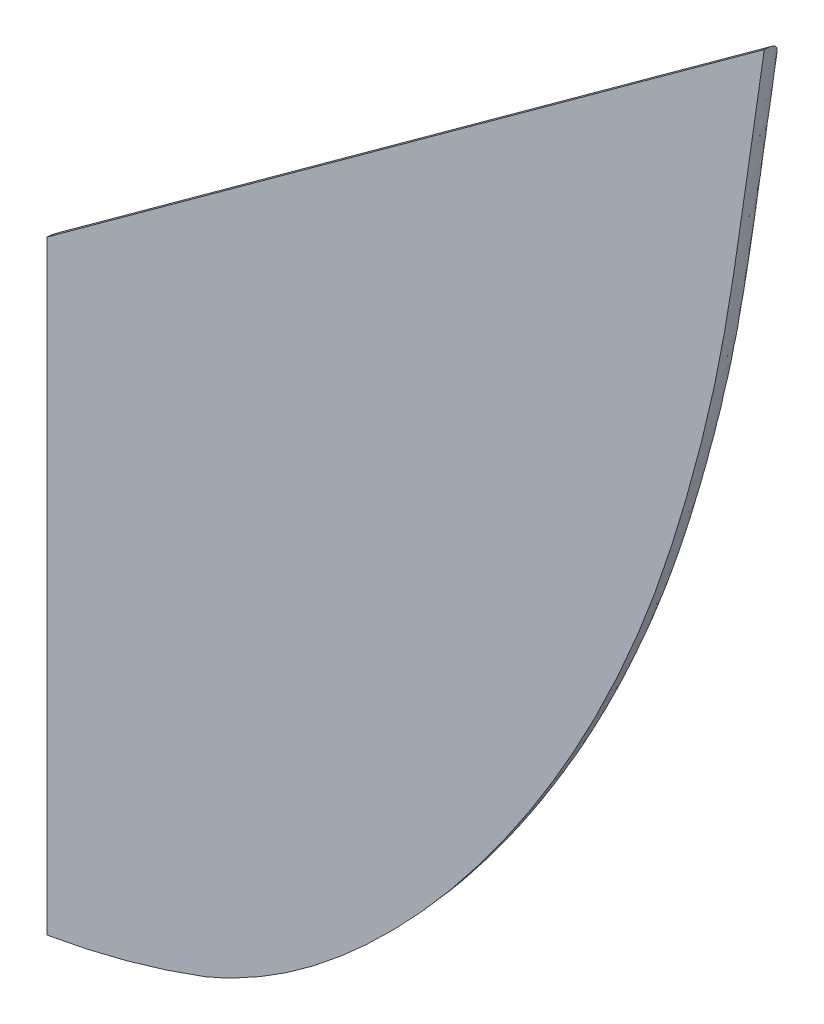
ISO-10303-21;
HEADER;
FILE_DESCRIPTION(('STEP AP214'),'2;1');
FILE_NAME('part.step','',(''),(''),'','','');
FILE_SCHEMA(('AUTOMOTIVE_DESIGN { 1 0 10303 214 1 1 1 1 }'));
ENDSEC;
DATA;
#1=APPLICATION_CONTEXT('core data for automotive mechanical design processes');
#2=APPLICATION_PROTOCOL_DEFINITION('international standard','automotive_design',2000,#1);
#3=PRODUCT_CONTEXT('',#1,'mechanical');
#4=PRODUCT('Part','Part','',(#3));
#5=PRODUCT_RELATED_PRODUCT_CATEGORY('part','',(#4));
#6=PRODUCT_DEFINITION_FORMATION('','',#4);
#7=PRODUCT_DEFINITION_CONTEXT('part definition',#1,'design');
#8=PRODUCT_DEFINITION('design','',#6,#7);
#9=PRODUCT_DEFINITION_SHAPE('','',#8);
#10=(LENGTH_UNIT() NAMED_UNIT(*) SI_UNIT(.MILLI.,.METRE.));
#11=(NAMED_UNIT(*) PLANE_ANGLE_UNIT() SI_UNIT($,.RADIAN.));
#12=(NAMED_UNIT(*) SI_UNIT($,.STERADIAN.) SOLID_ANGLE_UNIT());
#13=UNCERTAINTY_MEASURE_WITH_UNIT(LENGTH_MEASURE(1.E-05),#10,'distance_accuracy_value','');
#14=(GEOMETRIC_REPRESENTATION_CONTEXT(3) GLOBAL_UNCERTAINTY_ASSIGNED_CONTEXT((#13)) GLOBAL_UNIT_ASSIGNED_CONTEXT((#10,
#11,#12)) REPRESENTATION_CONTEXT('',''));
#15=CARTESIAN_POINT('',(0.,0.,0.));
#16=DIRECTION('',(0.,0.,1.));
#17=DIRECTION('',(1.,0.,0.));
#18=AXIS2_PLACEMENT_3D('',#15,#16,#17);
#19=CARTESIAN_POINT('',(130.75756911638,31.0759751053134,-1.14467768131097));
#20=DIRECTION('',(-0.809093604231756,-0.587679793219726,1.52475133105402E-05));
#21=DIRECTION('',(-0.587679793417526,0.80909360396028,-2.09594605061999E-05));
#22=AXIS2_PLACEMENT_3D('',#19,#20,#21);
#23=CYLINDRICAL_SURFACE('',#22,1.00000000000017);
#24=DIRECTION('',(-0.809093604231753,-0.587679793220006,1.52368888238317E-05));
#25=VECTOR('',#24,1.);
#26=CARTESIAN_POINT('',(139.352425500452,38.5547431867359,-1.14487156672482));
#27=LINE('',#26,#25);
#28=CARTESIAN_POINT('',(139.352425491807,38.5547431803267,-1.14487182181001));
#29=VERTEX_POINT('',#28);
#30=CARTESIAN_POINT('',(120.987353142415,25.2153942296326,-1.14452567025889));
#31=VERTEX_POINT('',#30);
#32=EDGE_CURVE('E106',#29,#31,#27,.T.);
#33=ORIENTED_EDGE('',*,*,#32,.F.);
#34=CARTESIAN_POINT('',(138.021027173442,36.3517139340818,-2.14481456214117));
#35=CARTESIAN_POINT('',(138.044914616573,36.3913245987506,-2.14481444479535));
#36=CARTESIAN_POINT('',(138.068808354182,36.4309317209375,-2.14433157605727));
#37=CARTESIAN_POINT('',(138.119829352194,36.5154849360455,-2.14225926465754));
#38=CARTESIAN_POINT('',(138.146956358072,36.5604277589641,-2.14052883661967));
#39=CARTESIAN_POINT('',(138.204440269134,36.6556504230444,-2.13551282753212));
#40=CARTESIAN_POINT('',(138.234794214632,36.7059236647612,-2.13206557453358));
#41=CARTESIAN_POINT('',(138.291219821142,36.7993077768855,-2.12412813901693));
#42=CARTESIAN_POINT('',(138.317295223292,36.8424346441796,-2.11985193303039));
#43=CARTESIAN_POINT('',(138.369477974665,36.9286635380226,-2.11002511885288));
#44=CARTESIAN_POINT('',(138.395585255475,36.9717652693112,-2.10447154651515));
#45=CARTESIAN_POINT('',(138.447635664188,37.058017994149,-2.09209670029287));
#46=CARTESIAN_POINT('',(138.47357830021,37.1011688852481,-2.08527264482612));
#47=CARTESIAN_POINT('',(138.527185211177,37.1903657160663,-2.06974221540705));
#48=CARTESIAN_POINT('',(138.554840951477,37.236399690184,-2.06093659961522));
#49=CARTESIAN_POINT('',(138.608434413312,37.325276106524,-2.04217262664027));
#50=CARTESIAN_POINT('',(138.634372812667,37.3681401589199,-2.03231897053418));
#51=CARTESIAN_POINT('',(138.684382456294,37.4507398953528,-2.01169967290987));
#52=CARTESIAN_POINT('',(138.708463841042,37.4904951667349,-2.0010372927875));
#53=CARTESIAN_POINT('',(138.754724963855,37.5668788488836,-1.97900951905835));
#54=CARTESIAN_POINT('',(138.776918307465,37.603528832044,-1.96774781345462));
#55=CARTESIAN_POINT('',(138.819384191235,37.6737071824561,-1.94473067254878));
#56=CARTESIAN_POINT('',(138.839673523663,37.7072594164158,-1.93307931629751));
#57=CARTESIAN_POINT('',(138.878342535015,37.7712396194916,-1.90948227622664));
#58=CARTESIAN_POINT('',(138.896740598515,37.8016951853737,-1.89764181153114));
#59=CARTESIAN_POINT('',(138.935783782891,37.866256832906,-1.87103569198479));
#60=CARTESIAN_POINT('',(138.956400541583,37.9003067160335,-1.8560905880942));
#61=CARTESIAN_POINT('',(138.995962289951,37.9656133858179,-1.82540596357176));
#62=CARTESIAN_POINT('',(139.014929674932,37.9969092168504,-1.80977892427148));
#63=CARTESIAN_POINT('',(139.051153661114,38.056706985495,-1.7778729196878));
#64=CARTESIAN_POINT('',(139.068438723906,38.0852539156758,-1.76171107546343));
#65=CARTESIAN_POINT('',(139.10128366916,38.1395467635796,-1.72886991402852));
#66=CARTESIAN_POINT('',(139.116877694487,38.1653455711152,-1.71231334986451));
#67=CARTESIAN_POINT('',(139.139415137792,38.2026582482913,-1.68668523506533));
#68=CARTESIAN_POINT('',(139.146570636481,38.2145088832403,-1.67828762828367));
#69=CARTESIAN_POINT('',(139.160456839389,38.2375097260996,-1.66142660106892));
#70=CARTESIAN_POINT('',(139.167192973265,38.248668800095,-1.65297980049724));
#71=CARTESIAN_POINT('',(139.180243002732,38.2702848845769,-1.63603674107537));
#72=CARTESIAN_POINT('',(139.186562741216,38.2807516830728,-1.6275575048564));
#73=CARTESIAN_POINT('',(139.198784379323,38.3009782535486,-1.61056211040462));
#74=CARTESIAN_POINT('',(139.204692510982,38.31074899785,-1.60206351724264));
#75=CARTESIAN_POINT('',(139.217472752752,38.3318690960119,-1.58299160296147));
#76=CARTESIAN_POINT('',(139.224312289534,38.3431615876842,-1.5723330985381));
#77=CARTESIAN_POINT('',(139.237442209241,38.3648403806385,-1.5508698719308));
#78=CARTESIAN_POINT('',(139.243743587529,38.3752448150221,-1.54009025645635));
#79=CARTESIAN_POINT('',(139.25579364507,38.3951421472502,-1.51840476772144));
#80=CARTESIAN_POINT('',(139.26155443618,38.404654998743,-1.50752400272341));
#81=CARTESIAN_POINT('',(139.272520852329,38.4227677367627,-1.48565818832843));
#82=CARTESIAN_POINT('',(139.277739706103,38.431389304687,-1.47469788833155));
#83=CARTESIAN_POINT('',(139.285230908949,38.4437666912818,-1.4580172824324));
#84=CARTESIAN_POINT('',(139.287633407932,38.44773654306,-1.45251311571739));
#85=CARTESIAN_POINT('',(139.292301048555,38.4554495138311,-1.44149035287415));
#86=CARTESIAN_POINT('',(139.294568042868,38.4591956890425,-1.43597468746902));
#87=CARTESIAN_POINT('',(139.298964793356,38.4664608643181,-1.42493181783663));
#88=CARTESIAN_POINT('',(139.301096459738,38.4699830294549,-1.41940745897766));
#89=CARTESIAN_POINT('',(139.305222811356,38.4768000715052,-1.4083501105954));
#90=CARTESIAN_POINT('',(139.307219456974,38.4800982080833,-1.40281986380408));
#91=CARTESIAN_POINT('',(139.311544037675,38.4872387021512,-1.39041034459398));
#92=CARTESIAN_POINT('',(139.313848901245,38.4910422895112,-1.38350060075035));
#93=CARTESIAN_POINT('',(139.318257285078,38.4983140547168,-1.36964142175426));
#94=CARTESIAN_POINT('',(139.320363996656,38.50178756442,-1.36269580331878));
#95=CARTESIAN_POINT('',(139.324374907234,38.5083994098357,-1.34877041195557));
#96=CARTESIAN_POINT('',(139.326282308755,38.5115430512502,-1.34179408707477));
#97=CARTESIAN_POINT('',(139.329893663462,38.5174950351082,-1.32781284137699));
#98=CARTESIAN_POINT('',(139.331600788275,38.5203086046108,-1.32081097042572));
#99=CARTESIAN_POINT('',(139.334810953727,38.5256004697762,-1.30678425990503));
#100=CARTESIAN_POINT('',(139.336317086631,38.5280838426045,-1.29976204850964));
#101=CARTESIAN_POINT('',(139.339124922942,38.5327153700914,-1.28570031433241));
#102=CARTESIAN_POINT('',(139.340429586736,38.5348683754084,-1.27866298471749));
#103=CARTESIAN_POINT('',(139.342834436739,38.5388392951084,-1.26457668078985));
#104=CARTESIAN_POINT('',(139.343937395891,38.5406617503307,-1.25752946364219));
#105=CARTESIAN_POINT('',(139.34593908971,38.5439717719197,-1.2434290348737));
#106=CARTESIAN_POINT('',(139.346840353118,38.545463482475,-1.23637715804792));
#107=CARTESIAN_POINT('',(139.348439194763,38.5481122782858,-1.22227300768913));
#108=CARTESIAN_POINT('',(139.349139002115,38.5492730241862,-1.21522167660644));
#109=CARTESIAN_POINT('',(139.35033580173,38.5512602869094,-1.20112416032867));
#110=CARTESIAN_POINT('',(139.350834671378,38.5520898968825,-1.19407857205113));
#111=CARTESIAN_POINT('',(139.351630605011,38.5534151498223,-1.17999789776171));
#112=CARTESIAN_POINT('',(139.351929150865,38.5539132448975,-1.17296312752989));
#113=CARTESIAN_POINT('',(139.352326246325,38.5545765562877,-1.15890960186496));
#114=CARTESIAN_POINT('',(139.352425843517,38.5547435161967,-1.15189095797054));
#115=CARTESIAN_POINT('',(139.352425494135,38.5547431954235,-1.14487194935308));
#116=B_SPLINE_CURVE_WITH_KNOTS('',3,(#34,#35,#36,#37,#38,#39,#40,#41,#42,#43,#44,#45,#46,#47,
#48,#49,#50,#51,#52,#53,#54,#55,#56,#57,#58,#59,#60,#61,#62,#63,#64,#65,#66,#67,#68,#69,#70,#71,
#72,#73,#74,#75,#76,#77,#78,#79,#80,#81,#82,#83,#84,#85,#86,#87,#88,#89,#90,#91,#92,#93,#94,#95,
#96,#97,#98,#99,#100,#101,#102,#103,#104,#105,#106,#107,#108,#109,#110,#111,#112,#113,#114,
#115),.UNSPECIFIED.,.F.,.F.,(4,2,2,2,2,2,2,2,2,2,2,2,2,2,2,2,2,2,2,2,2,2,2,2,2,2,2,2,2,2,2,2,2,
2,2,2,2,2,2,2,4),(0.,0.138765816331621,0.296321630101272,0.47278023697859,0.624499481512307,
0.776574409525273,0.928986289979477,1.09221896181717,1.24537617473763,1.3884147819176,
1.52129603596213,1.64398777422882,1.75646729790675,1.88398178416957,2.00331541352942,
2.11451157852475,2.21763492889782,2.26620283487551,2.31279203867814,2.35742172156249,
2.40011496676941,2.45100072609805,2.49974128577946,2.54639770652997,2.59104133265807,
2.61263612890787,2.63376012789903,2.65442592942912,2.67464711933551,2.69929163750686,
2.72342342118119,2.74707359817171,2.77027538181929,2.79306410044193,2.81547719593901,
2.83755418602709,2.85933658521241,2.88086778076977,2.90219286172311,2.92335840106794,
2.94441219410462),.UNSPECIFIED.);
#117=CARTESIAN_POINT('',(138.02102717086,36.3517139356398,-2.14481456214121));
#118=VERTEX_POINT('',#117);
#119=EDGE_CURVE('E11',#118,#29,#116,.T.);
#120=ORIENTED_EDGE('',*,*,#119,.F.);
#121=DIRECTION('',(0.809093604114845,0.587679793380684,-1.5247513584563E-05));
#122=VECTOR('',#121,1.);
#123=CARTESIAN_POINT('',(121.987353142464,24.7057607432537,-2.14451240468828));
#124=LINE('',#123,#122);
#125=CARTESIAN_POINT('',(121.987353141371,24.7057607411099,-2.14451240468822));
#126=VERTEX_POINT('',#125);
#127=EDGE_CURVE('E99',#126,#118,#124,.T.);
#128=ORIENTED_EDGE('',*,*,#127,.F.);
#129=CARTESIAN_POINT('',(121.987353142084,24.7057866829727,-1.14451240502479));
#130=DIRECTION('',(-0.454048569568648,-0.890976933449068,2.31162390257658E-05));
#131=DIRECTION('',(-0.890976933748941,0.454048569415845,-1.17796260607286E-05));
#132=AXIS2_PLACEMENT_3D('',#129,#130,#131);
#133=ELLIPSE('',#132,1.12236351113499,0.999999999999921);
#134=EDGE_CURVE('E85',#31,#126,#133,.T.);
#135=ORIENTED_EDGE('',*,*,#134,.F.);
#136=EDGE_LOOP('',(#33,#120,#128,#135));
#137=FACE_BOUND('',#136,.T.);
#138=ADVANCED_FACE('F40',(#137),#23,.T.);
#139=CARTESIAN_POINT('',(125.048114137449,10.8492858505844,-1.14415290582435));
#140=CARTESIAN_POINT('',(125.048114136929,10.8492599060261,-2.14415290548779));
#141=CARTESIAN_POINT('',(124.692585216444,11.7839251862793,-2.14417715478062));
#142=CARTESIAN_POINT('',(123.732814684403,10.3477243251995,-1.14413989163257));
#143=CARTESIAN_POINT('',(123.732814678694,10.3476983805804,-2.14413989200938));
#144=CARTESIAN_POINT('',(123.439156693425,11.3060855099224,-2.14416475678916));
#145=CARTESIAN_POINT('',(122.365022761397,9.98285973200182,-1.1441304266946));
#146=CARTESIAN_POINT('',(122.36502276482,9.98283378601033,-2.14413042505032));
#147=CARTESIAN_POINT('',(122.137428817308,10.9584295631409,-2.14415573633194));
#148=CARTESIAN_POINT('',(120.98735313336,9.74447517154362,-1.14412423911375));
#149=CARTESIAN_POINT('',(120.987353132972,9.74444922622394,-2.14412423955002));
#150=CARTESIAN_POINT('',(120.816044456824,10.7296666328752,-2.14414980049127));
#151=(BOUNDED_SURFACE() B_SPLINE_SURFACE(3,2,((#139,#140,#141),(#142,#143,#144),(#145,#146,
#147),(#148,#149,#150)),.UNSPECIFIED.,.F.,.F.,.F.) B_SPLINE_SURFACE_WITH_KNOTS((4,4),(3,3),(0.,
4.02355662225226),(0.,1.5707999648493),
.UNSPECIFIED.) GEOMETRIC_REPRESENTATION_ITEM() RATIONAL_B_SPLINE_SURFACE(((1.,0.707106781186542,
1.),(1.,0.707106781910117,1.),(1.,0.707106779802818,1.),(1.,0.707106780913303,1.))) REPRESENTATION_ITEM('') SURFACE());
#152=CARTESIAN_POINT('',(125.048114137449,10.8492858505844,-1.14415290582436));
#153=CARTESIAN_POINT('',(124.399350701482,10.6018936861582,-1.1441464870064));
#154=CARTESIAN_POINT('',(123.737459106902,10.387622424399,-1.14414092777034));
#155=CARTESIAN_POINT('',(122.382229088601,10.0189077286649,-1.14413136092533));
#156=CARTESIAN_POINT('',(121.687100172249,9.8655556446141,-1.14412738163005));
#157=CARTESIAN_POINT('',(120.98735313336,9.7444751715436,-1.1441242398866));
#158=(BOUNDED_CURVE() B_SPLINE_CURVE(3,(#152,#153,#154,#155,#156,#157),.UNSPECIFIED.,.F.,
.F.) B_SPLINE_CURVE_WITH_KNOTS((4,2,4),(0.,0.208299589778262,0.421349501701009),
.UNSPECIFIED.) CURVE() GEOMETRIC_REPRESENTATION_ITEM() RATIONAL_B_SPLINE_CURVE((1.,1.,1.,1.,1.,1.)) REPRESENTATION_ITEM(''));
#159=CARTESIAN_POINT('',(125.048114137449,10.8492858505844,-1.14415290650398));
#160=VERTEX_POINT('',#159);
#161=CARTESIAN_POINT('',(120.98735313336,9.7444751715435,-1.14412424475197));
#162=VERTEX_POINT('',#161);
#163=EDGE_CURVE('E120',#160,#162,#158,.T.);
#164=CARTESIAN_POINT('',(120.98735313336,9.74447517154362,-1.14412423911375));
#165=CARTESIAN_POINT('',(120.987353096477,9.74447489542966,-1.15124691519326));
#166=CARTESIAN_POINT('',(120.987433631938,9.74456595711364,-1.15836950336764));
#167=CARTESIAN_POINT('',(120.98775374651,9.74493057299091,-1.17264333722244));
#168=CARTESIAN_POINT('',(120.98799414624,9.7452050688283,-1.17979454053649));
#169=CARTESIAN_POINT('',(120.988633619062,9.74593840351737,-1.19412060940482));
#170=CARTESIAN_POINT('',(120.989033573878,9.74639826688556,-1.20129538295553));
#171=CARTESIAN_POINT('',(120.989991750805,9.74750385960667,-1.21566355250756));
#172=CARTESIAN_POINT('',(120.990550909894,9.74815068968388,-1.22285680117125));
#173=CARTESIAN_POINT('',(120.991827124186,9.74963157581801,-1.23725675920394));
#174=CARTESIAN_POINT('',(120.992545166202,9.75046680265595,-1.24446326051238));
#175=CARTESIAN_POINT('',(120.994138792298,9.75232562522069,-1.25888447445735));
#176=CARTESIAN_POINT('',(120.99501540761,9.75335045502909,-1.26609891384878));
#177=CARTESIAN_POINT('',(120.996925849363,9.75558941506639,-1.28053067192455));
#178=CARTESIAN_POINT('',(120.997960746238,9.75680483576522,-1.2877476484544));
#179=CARTESIAN_POINT('',(121.000187442727,9.75942568811208,-1.30217907979333));
#180=CARTESIAN_POINT('',(121.001380346958,9.76083245953762,-1.30939312057926));
#181=CARTESIAN_POINT('',(121.003922773393,9.7638364983226,-1.323813222536));
#182=CARTESIAN_POINT('',(121.00527342963,9.76543514762954,-1.33101879557503));
#183=CARTESIAN_POINT('',(121.008131099372,9.76882319660661,-1.34541646028962));
#184=CARTESIAN_POINT('',(121.009639271828,9.77061401326528,-1.35260798816776));
#185=CARTESIAN_POINT('',(121.012811738088,9.77438641730744,-1.3669720309389));
#186=CARTESIAN_POINT('',(121.014477211553,9.77636944967136,-1.37414390545455));
#187=CARTESIAN_POINT('',(121.017964068313,9.78052606742543,-1.38846309190821));
#188=CARTESIAN_POINT('',(121.019786648069,9.78270111886489,-1.39560968654901));
#189=CARTESIAN_POINT('',(121.023587533478,9.78724132082098,-1.40987276736227));
#190=CARTESIAN_POINT('',(121.02556704881,9.78960795174947,-1.41698845958222));
#191=CARTESIAN_POINT('',(121.029681638309,9.79453060691957,-1.43118417948337));
#192=CARTESIAN_POINT('',(121.031817932004,9.7970881193278,-1.43826333706433));
#193=CARTESIAN_POINT('',(121.036245969393,9.80239163461203,-1.4523805430394));
#194=CARTESIAN_POINT('',(121.038538939758,9.80513912754861,-1.45941764708648));
#195=CARTESIAN_POINT('',(121.043280123874,9.8108212975808,-1.4734450226244));
#196=CARTESIAN_POINT('',(121.045729567609,9.81375745917279,-1.4804342741377));
#197=CARTESIAN_POINT('',(121.053346296801,9.82288741338569,-1.50142182402655));
#198=CARTESIAN_POINT('',(121.05871919074,9.82932740204231,-1.5152399288964));
#199=CARTESIAN_POINT('',(121.070080498517,9.84293087724433,-1.54262899286554));
#200=CARTESIAN_POINT('',(121.076078746476,9.85010587718924,-1.55619011893823));
#201=CARTESIAN_POINT('',(121.087699872301,9.86397929124133,-1.58091815976147));
#202=CARTESIAN_POINT('',(121.093259051046,9.87060534209112,-1.59215587302662));
#203=CARTESIAN_POINT('',(121.104889429463,9.88446373446947,-1.61459173261335));
#204=CARTESIAN_POINT('',(121.110971470712,9.89170886646141,-1.62577634163976));
#205=CARTESIAN_POINT('',(121.123644202515,9.90681350683085,-1.64807411976808));
#206=CARTESIAN_POINT('',(121.130244995479,9.91468532402919,-1.65917318520296));
#207=CARTESIAN_POINT('',(121.143951923437,9.93104922292744,-1.68126689924599));
#208=CARTESIAN_POINT('',(121.151067455625,9.93955307196575,-1.69224698169513));
#209=CARTESIAN_POINT('',(121.165800720408,9.95718440124342,-1.71406850275727));
#210=CARTESIAN_POINT('',(121.17342719023,9.96632305300867,-1.72489499556515));
#211=CARTESIAN_POINT('',(121.189179343032,9.98522468961614,-1.74637424367478));
#212=CARTESIAN_POINT('',(121.197313152226,9.99499820516627,-1.75701175331669));
#213=CARTESIAN_POINT('',(121.214077298599,10.0151673883166,-1.77807727560745));
#214=CARTESIAN_POINT('',(121.222715205618,10.0255729059756,-1.78848981410981));
#215=CARTESIAN_POINT('',(121.2404847886,10.0470011053171,-1.8090695326552));
#216=CARTESIAN_POINT('',(121.24962352075,10.0580329289192,-1.81922108426791));
#217=CARTESIAN_POINT('',(121.268393565737,10.0807050843535,-1.83924227365895));
#218=CARTESIAN_POINT('',(121.278031508477,10.0923538065114,-1.84909617286163));
#219=CARTESIAN_POINT('',(121.29779413947,10.1162504000628,-1.86848877809062));
#220=CARTESIAN_POINT('',(121.307924943248,10.1285059560854,-1.87801177683229));
#221=CARTESIAN_POINT('',(121.326329766504,10.1507458615939,-1.89457712660308));
#222=CARTESIAN_POINT('',(121.334561227492,10.1606838229194,-1.90172938168053));
#223=CARTESIAN_POINT('',(121.35161829295,10.181267353047,-1.91605551826667));
#224=CARTESIAN_POINT('',(121.360451380487,10.1919214132142,-1.92320824064947));
#225=CARTESIAN_POINT('',(121.38852463183,10.2258102297861,-1.94517625114861));
#226=CARTESIAN_POINT('',(121.407977532901,10.249334176457,-1.95927873558492));
#227=CARTESIAN_POINT('',(121.449147519361,10.2992986552925,-1.98704795837641));
#228=CARTESIAN_POINT('',(121.470902792827,10.3258024964454,-2.00054311970553));
#229=CARTESIAN_POINT('',(121.516641824837,10.3817172599875,-2.02664664518678));
#230=CARTESIAN_POINT('',(121.540657312475,10.4111832387372,-2.039081028752));
#231=CARTESIAN_POINT('',(121.590876210474,10.472937152487,-2.06260067683456));
#232=CARTESIAN_POINT('',(121.617107111245,10.505269271998,-2.07351141408464));
#233=CARTESIAN_POINT('',(121.659888635087,10.5578957143357,-2.0891651779219));
#234=CARTESIAN_POINT('',(121.676310859103,10.5780722191807,-2.09467243549042));
#235=CARTESIAN_POINT('',(121.717707995022,10.6291067961776,-2.10741879301827));
#236=CARTESIAN_POINT('',(121.742711052518,10.6600893107556,-2.11407929221552));
#237=CARTESIAN_POINT('',(121.783424683697,10.7106289880312,-2.12326141726078));
#238=CARTESIAN_POINT('',(121.799098631762,10.7301071838795,-2.12639801103438));
#239=CARTESIAN_POINT('',(121.828763183449,10.7670114673877,-2.13160033779323));
#240=CARTESIAN_POINT('',(121.842750441104,10.7844290444894,-2.133745663754));
#241=CARTESIAN_POINT('',(121.880954561311,10.8320616421851,-2.13878159828846));
#242=CARTESIAN_POINT('',(121.905182247174,10.8623332777847,-2.14107232146677));
#243=CARTESIAN_POINT('',(121.948727419561,10.9168222427121,-2.14359766754233));
#244=CARTESIAN_POINT('',(121.968045796191,10.9410243203855,-2.1441547026714));
#245=CARTESIAN_POINT('',(121.987353133551,10.9652311846383,-2.14415591271892));
#246=B_SPLINE_CURVE_WITH_KNOTS('',3,(#164,#165,#166,#167,#168,#169,#170,#171,#172,#173,#174,
#175,#176,#177,#178,#179,#180,#181,#182,#183,#184,#185,#186,#187,#188,#189,#190,#191,#192,#193,
#194,#195,#196,#197,#198,#199,#200,#201,#202,#203,#204,#205,#206,#207,#208,#209,#210,#211,#212,
#213,#214,#215,#216,#217,#218,#219,#220,#221,#222,#223,#224,#225,#226,#227,#228,#229,#230,#231,
#232,#233,#234,#235,#236,#237,#238,#239,#240,#241,#242,#243,#244,#245),.UNSPECIFIED.,.F.,.F.,(4,
2,2,2,2,2,2,2,2,2,2,2,2,2,2,2,2,2,2,2,2,2,2,2,2,2,2,2,2,2,2,2,2,2,2,2,2,2,2,2,4),(0.,
0.0213668571784941,0.0428442506596642,0.0644420127841798,0.0861696109964345,0.108036147929842,
0.130050363830349,0.152220641148804,0.174555011118025,0.197061162120032,0.21974644964314,
0.242617907626111,0.265682260987658,0.28894593914343,0.312415090318773,0.3360955964736,
0.359993088665056,0.408455139496771,0.457847282910094,0.500374552400249,0.544304879693294,
0.589661187937944,0.636461051311794,0.684717184088048,0.734437902132748,0.785627559518763,
0.838286963465369,0.892413770836937,0.948002869121091,0.992258168720676,1.03898839766916,
1.13980341020162,1.25028950663775,1.37020508204838,1.49924065261298,1.57900273664634,
1.70004071828917,1.77562235484373,1.84293915411359,1.95941688301158,2.05230932808269),.UNSPECIFIED.);
#247=CARTESIAN_POINT('',(121.987353134359,10.965231184628,-2.14415591271892));
#248=VERTEX_POINT('',#247);
#249=EDGE_CURVE('E60',#248,#162,#246,.F.);
#250=CARTESIAN_POINT('',(111.95260545863,30.6018664576039,-2.14466537132521));
#251=DIRECTION('',(-5.202879431221E-10,-2.59445582197979E-05,-0.99999999966344));
#252=DIRECTION('',(0.881835114454848,-0.471557876368042,1.22339019733745E-05));
#253=AXIS2_PLACEMENT_3D('',#250,#251,#252);
#254=ELLIPSE('',#253,24.2770248169263,18.8944627847947);
#255=CARTESIAN_POINT('',(124.678470328644,11.7785505007793,-2.14417701532943));
#256=VERTEX_POINT('',#255);
#257=EDGE_CURVE('E100',#256,#248,#254,.T.);
#258=CARTESIAN_POINT('',(125.048114137449,10.8492858505844,-1.14415290650398));
#259=CARTESIAN_POINT('',(125.048114137399,10.8492841686989,-1.20898061976182));
#260=CARTESIAN_POINT('',(125.045778692514,10.8551386461897,-1.27365499856483));
#261=CARTESIAN_POINT('',(125.036212857754,10.8791247727976,-1.40486316911723));
#262=CARTESIAN_POINT('',(125.02870995554,10.8979399405042,-1.47090794244402));
#263=CARTESIAN_POINT('',(125.000171147947,10.969525877965,-1.65275083159936));
#264=CARTESIAN_POINT('',(124.973307874477,11.0369247126396,-1.76037270631534));
#265=CARTESIAN_POINT('',(124.906013483875,11.2059051731433,-1.94223089285442));
#266=CARTESIAN_POINT('',(124.866210306874,11.3059124001961,-2.01477068629232));
#267=CARTESIAN_POINT('',(124.77759006439,11.5288198393111,-2.11639578330997));
#268=CARTESIAN_POINT('',(124.729437466511,11.6500576355855,-2.14331977402727));
#269=CARTESIAN_POINT('',(124.680024550738,11.7746320478198,-2.14417025130463));
#270=CARTESIAN_POINT('',(124.679247433837,11.7765912690613,-2.14417696449843));
#271=CARTESIAN_POINT('',(124.678470328524,11.778550500731,-2.14417701532943));
#272=(BOUNDED_CURVE() B_SPLINE_CURVE(3,(#258,#259,#260,#261,#262,#263,#264,#265,#266,#267,#268,
#269,#270,#271),.UNSPECIFIED.,.F.,.F.) B_SPLINE_CURVE_WITH_KNOTS((4,2,2,2,2,2,4),
(6.79634808891021E-11,0.0194483140434672,0.0401175519843876,0.0786979959250355,0.11727945654109,
0.15685275299538,0.157485066519175),
.UNSPECIFIED.) CURVE() GEOMETRIC_REPRESENTATION_ITEM() RATIONAL_B_SPLINE_CURVE((1.,1.,1.,1.,1.,
1.,1.,1.,1.,1.,1.,1.,1.,1.)) REPRESENTATION_ITEM(''));
#273=EDGE_CURVE('E52',#160,#256,#272,.T.);
#274=ORIENTED_EDGE('',*,*,#163,.T.);
#275=ORIENTED_EDGE('',*,*,#249,.F.);
#276=ORIENTED_EDGE('',*,*,#257,.F.);
#277=ORIENTED_EDGE('',*,*,#273,.F.);
#278=EDGE_LOOP('',(#274,#275,#276,#277));
#279=FACE_BOUND('',#278,.T.);
#280=ADVANCED_FACE('F145',(#279),#151,.T.);
#281=CARTESIAN_POINT('',(139.352425494135,38.5547431954235,-1.14487194935308));
#282=CARTESIAN_POINT('',(139.352425265792,38.5547172841144,-2.14487171878259));
#283=CARTESIAN_POINT('',(138.362904258237,38.6991046627995,-2.14487546433451));
#284=CARTESIAN_POINT('',(139.16355726034,37.2758026111702,-1.14483837324159));
#285=CARTESIAN_POINT('',(139.163557406661,37.2757765379819,-2.14483853712063));
#286=CARTESIAN_POINT('',(138.175857024802,37.4321733819369,-2.1448425942648));
#287=CARTESIAN_POINT('',(138.80703118007,34.7834358449695,-1.14477396781053));
#288=CARTESIAN_POINT('',(138.807031112335,34.7834100906974,-2.14477387360741));
#289=CARTESIAN_POINT('',(137.813165527143,34.8986125864354,-2.14477686196048));
#290=CARTESIAN_POINT('',(138.249286121368,30.9726962552897,-1.14467495926815));
#291=CARTESIAN_POINT('',(138.249286141161,30.9726701283793,-2.14467500534071));
#292=CARTESIAN_POINT('',(137.267228347793,31.1678026077095,-2.14468006745967));
#293=CARTESIAN_POINT('',(137.402468303416,27.651455777735,-1.14458886455335));
#294=CARTESIAN_POINT('',(137.402468302483,27.6514299863656,-2.14458883679812));
#295=CARTESIAN_POINT('',(136.440017414872,27.927385886971,-2.14459599584895));
#296=CARTESIAN_POINT('',(136.484581941501,24.8139786813289,-1.14451520296322));
#297=CARTESIAN_POINT('',(136.484581933629,24.8139526205591,-2.14451521922001));
#298=CARTESIAN_POINT('',(135.545123453681,25.1584651442609,-2.14452415695789));
#299=CARTESIAN_POINT('',(135.369604423919,22.1878688734086,-1.14444709529985));
#300=CARTESIAN_POINT('',(135.36960443297,22.1878430084612,-2.14444708538839));
#301=CARTESIAN_POINT('',(134.467769369867,22.6247148979866,-2.14445841936653));
#302=CARTESIAN_POINT('',(133.936707475788,19.5108432298242,-1.14437762617145));
#303=CARTESIAN_POINT('',(133.936707467454,19.5108172412975,-2.14437763039073));
#304=CARTESIAN_POINT('',(133.07866136973,20.0268397902815,-2.14439101792177));
#305=CARTESIAN_POINT('',(132.312956930562,17.1107019912866,-1.14431536208788));
#306=CARTESIAN_POINT('',(132.312956937131,17.1106760771823,-2.14431535894434));
#307=CARTESIAN_POINT('',(131.507561689084,17.7064274210779,-2.14433081503049));
#308=CARTESIAN_POINT('',(130.637342273727,15.0659869242354,-1.14426230560101));
#309=CARTESIAN_POINT('',(130.637342261182,15.0659609372231,-2.14426230884095));
#310=CARTESIAN_POINT('',(129.891196038184,15.7329089939874,-2.14427961212575));
#311=CARTESIAN_POINT('',(128.468498153954,12.8686289253549,-1.14420532548209));
#312=CARTESIAN_POINT('',(128.468498273005,12.868603329646,-2.14420529824286));
#313=CARTESIAN_POINT('',(127.818262978548,13.6416937388426,-2.14422535539129));
#314=CARTESIAN_POINT('',(126.533979931927,11.4719812639256,-1.14416906628202));
#315=CARTESIAN_POINT('',(126.533979954856,11.4719553743696,-2.14416906182084));
#316=CARTESIAN_POINT('',(125.998440871483,12.3275158647014,-2.14419125868005));
#317=CARTESIAN_POINT('',(125.048114137449,10.8492858505844,-1.14415290582435));
#318=CARTESIAN_POINT('',(125.048114136929,10.8492599060262,-2.14415290548779));
#319=CARTESIAN_POINT('',(124.669521728383,11.7748234033697,-2.14417691862688));
#320=(BOUNDED_SURFACE() B_SPLINE_SURFACE(3,2,((#281,#282,#283),(#284,#285,#286),(#287,#288,
#289),(#290,#291,#292),(#293,#294,#295),(#296,#297,#298),(#299,#300,#301),(#302,#303,#304),
(#305,#306,#307),(#308,#309,#310),(#311,#312,#313),(#314,#315,#316),(#317,#318,#319)),
.UNSPECIFIED.,.F.,.F.,.F.) B_SPLINE_SURFACE_WITH_KNOTS((4,1,1,1,1,1,1,1,1,1,4),(3,3),
(-5.61158553086282E-06,3.84088963469558,7.68178488097669,11.3041327834647,13.8582577080387,
16.4123826326127,19.5506831555747,22.6889836785367,24.8048473645613,27.2002425309555,
31.4952647282214),(0.,1.57079633301511),
.UNSPECIFIED.) GEOMETRIC_REPRESENTATION_ITEM() RATIONAL_B_SPLINE_SURFACE(((1.,0.707106862587149,
1.),(1.,0.707106723212261,1.),(1.,0.707106814315202,1.),(1.,0.707106764807305,1.),(1.,
0.707106790863572,1.),(1.,0.707106775329924,1.),(1.,0.707106784565876,1.),(1.,0.707106779578579,
1.),(1.,0.707106782177269,1.),(1.,0.707106779924235,1.),(1.,0.707106790679691,1.),(1.,
0.707106781780033,1.),(1.,0.707106781186544,1.))) REPRESENTATION_ITEM('') SURFACE());
#321=CARTESIAN_POINT('',(139.352425491903,38.5547431803091,-1.14487194935268));
#322=CARTESIAN_POINT('',(139.163557258935,37.275802601352,-1.14483837324134));
#323=CARTESIAN_POINT('',(138.807031179324,34.7834358398688,-1.14477396781039));
#324=CARTESIAN_POINT('',(138.249286121368,30.9726962552897,-1.14467495926815));
#325=CARTESIAN_POINT('',(137.402468303416,27.651455777735,-1.14458886455335));
#326=CARTESIAN_POINT('',(136.484581941501,24.8139786813289,-1.14451520296322));
#327=CARTESIAN_POINT('',(135.369604423919,22.1878688734086,-1.14444709529985));
#328=CARTESIAN_POINT('',(133.936707475788,19.5108432298242,-1.14437762617145));
#329=CARTESIAN_POINT('',(132.312956930562,17.1107019912866,-1.14431536208788));
#330=CARTESIAN_POINT('',(130.637342273727,15.0659869242354,-1.14426230560101));
#331=CARTESIAN_POINT('',(128.468498153954,12.8686289253549,-1.14420532548209));
#332=CARTESIAN_POINT('',(126.533979931927,11.4719812639256,-1.14416906628202));
#333=CARTESIAN_POINT('',(125.048114137449,10.8492858505844,-1.14415290582435));
#334=(BOUNDED_CURVE() B_SPLINE_CURVE(3,(#321,#322,#323,#324,#325,#326,#327,#328,#329,#330,#331,
#332,#333),.UNSPECIFIED.,.F.,.F.) B_SPLINE_CURVE_WITH_KNOTS((4,1,1,1,1,1,1,1,1,1,4),
(-5.59645509412285E-06,3.84088963469558,7.68178488097669,11.3041327834647,13.8582577080387,
16.4123826326127,19.5506831555747,22.6889836785367,24.8048473645613,27.2002425309555,
31.4952647282214),
.UNSPECIFIED.) CURVE() GEOMETRIC_REPRESENTATION_ITEM() RATIONAL_B_SPLINE_CURVE((1.,1.,1.,1.,1.,
1.,1.,1.,1.,1.,1.,1.,1.)) REPRESENTATION_ITEM(''));
#335=EDGE_CURVE('E116',#29,#160,#334,.T.);
#336=CARTESIAN_POINT('',(138.021027167929,36.3517139391959,-2.1448145621413));
#337=CARTESIAN_POINT('',(137.951061648474,35.8672440369729,-2.14480199274731));
#338=CARTESIAN_POINT('',(137.698599663425,34.1156956433368,-2.14475654946665));
#339=CARTESIAN_POINT('',(137.267228347793,31.1678026077095,-2.14468006745967));
#340=CARTESIAN_POINT('',(136.440017414872,27.927385886971,-2.14459599584895));
#341=CARTESIAN_POINT('',(135.545123453681,25.1584651442609,-2.14452415695789));
#342=CARTESIAN_POINT('',(134.467769369867,22.6247148979866,-2.14445841936653));
#343=CARTESIAN_POINT('',(133.07866136973,20.0268397902815,-2.14439101792177));
#344=CARTESIAN_POINT('',(131.507561689084,17.7064274210779,-2.14433081503049));
#345=CARTESIAN_POINT('',(129.891196038184,15.7329089939874,-2.14427961212575));
#346=CARTESIAN_POINT('',(127.820532902492,13.6439836823398,-2.14422541480404));
#347=CARTESIAN_POINT('',(126.003686314359,12.3313047799912,-2.14419135698451));
#348=CARTESIAN_POINT('',(124.678470328644,11.7785505007808,-2.14417701532943));
#349=(BOUNDED_CURVE() B_SPLINE_CURVE(3,(#336,#337,#338,#339,#340,#341,#342,#343,#344,#345,#346,
#347,#348),.UNSPECIFIED.,.F.,.F.) B_SPLINE_CURVE_WITH_KNOTS((4,1,1,1,1,1,1,1,1,1,4),
(2.37218743150246,3.84088963469558,7.68178488097669,11.3041327834647,13.8582577080387,
16.4123826326127,19.5506831555747,22.6889836785367,24.8048473645613,27.2002425309555,
31.4856215860463),
.UNSPECIFIED.) CURVE() GEOMETRIC_REPRESENTATION_ITEM() RATIONAL_B_SPLINE_CURVE((1.,1.,1.,1.,1.,
1.,1.,1.,1.,1.,1.,1.,1.)) REPRESENTATION_ITEM(''));
#350=EDGE_CURVE('E103',#118,#256,#349,.T.);
#351=ORIENTED_EDGE('',*,*,#335,.T.);
#352=ORIENTED_EDGE('',*,*,#273,.T.);
#353=ORIENTED_EDGE('',*,*,#350,.F.);
#354=ORIENTED_EDGE('',*,*,#119,.T.);
#355=EDGE_LOOP('',(#351,#352,#353,#354));
#356=FACE_BOUND('',#355,.T.);
#357=ADVANCED_FACE('F142',(#356),#320,.T.);
#358=CARTESIAN_POINT('',(121.98735313787,17.4799347032237,-1.14432493348728));
#359=DIRECTION('',(5.83133424884587E-10,0.99999999966344,-2.59445582306862E-05));
#360=DIRECTION('',(-5.20206100418404E-10,-2.59445582306859E-05,-0.99999999966344));
#361=AXIS2_PLACEMENT_3D('',#358,#359,#360);
#362=CYLINDRICAL_SURFACE('',#361,0.999999999999921);
#363=DIRECTION('',(-5.89824700531256E-10,-0.99999999966344,2.59445582298094E-05));
#364=VECTOR('',#363,1.);
#365=CARTESIAN_POINT('',(121.987353142464,24.7057607432537,-2.14451240468828));
#366=LINE('',#365,#364);
#367=EDGE_CURVE('E90',#126,#248,#366,.T.);
#368=ORIENTED_EDGE('',*,*,#367,.T.);
#369=ORIENTED_EDGE('',*,*,#249,.T.);
#370=DIRECTION('',(5.83132857405987E-10,0.999999999663455,-2.59439753553899E-05));
#371=VECTOR('',#370,1.);
#372=CARTESIAN_POINT('',(120.987353133359,9.74447517154337,-1.14412424890787));
#373=LINE('',#372,#371);
#374=EDGE_CURVE('E93',#162,#31,#373,.T.);
#375=ORIENTED_EDGE('',*,*,#374,.T.);
#376=ORIENTED_EDGE('',*,*,#134,.T.);
#377=EDGE_LOOP('',(#368,#369,#375,#376));
#378=FACE_BOUND('',#377,.T.);
#379=ADVANCED_FACE('F89',(#378),#362,.T.);
#380=CARTESIAN_POINT('',(83.4160170765182,61.6063518281539,-2.14546975415462));
#381=DIRECTION('',(-5.2028532899658E-10,-2.59445582298355E-05,-0.99999999966344));
#382=DIRECTION('',(0.,-0.99999999966344,2.59445582298355E-05));
#383=AXIS2_PLACEMENT_3D('',#380,#381,#382);
#384=PLANE('',#383);
#385=ORIENTED_EDGE('',*,*,#127,.T.);
#386=ORIENTED_EDGE('',*,*,#350,.T.);
#387=ORIENTED_EDGE('',*,*,#257,.T.);
#388=ORIENTED_EDGE('',*,*,#367,.F.);
#389=EDGE_LOOP('',(#385,#386,#387,#388));
#390=FACE_BOUND('',#389,.T.);
#391=ADVANCED_FACE('F42',(#390),#384,.T.);
#392=CARTESIAN_POINT('',(114.930716170699,9.42839326819983,-1.14411603613007));
#393=DIRECTION('',(5.20285328992924E-10,2.59445582298369E-05,0.99999999966344));
#394=DIRECTION('',(0.999999999798924,-2.00537362894838E-05,0.));
#395=AXIS2_PLACEMENT_3D('',#392,#393,#394);
#396=PLANE('',#395);
#397=ORIENTED_EDGE('',*,*,#163,.F.);
#398=ORIENTED_EDGE('',*,*,#335,.F.);
#399=ORIENTED_EDGE('',*,*,#32,.T.);
#400=ORIENTED_EDGE('',*,*,#374,.F.);
#401=EDGE_LOOP('',(#397,#398,#399,#400));
#402=FACE_BOUND('',#401,.T.);
#403=ADVANCED_FACE('F150',(#402),#396,.T.);
#404=CLOSED_SHELL('',(#138,#280,#357,#379,#391,#403));
#405=MANIFOLD_SOLID_BREP('B2',#404);
#406=ADVANCED_BREP_SHAPE_REPRESENTATION('',(#18,#405),#14);
#407=SHAPE_DEFINITION_REPRESENTATION(#9,#406);
ENDSEC;
END-ISO-10303-21;
